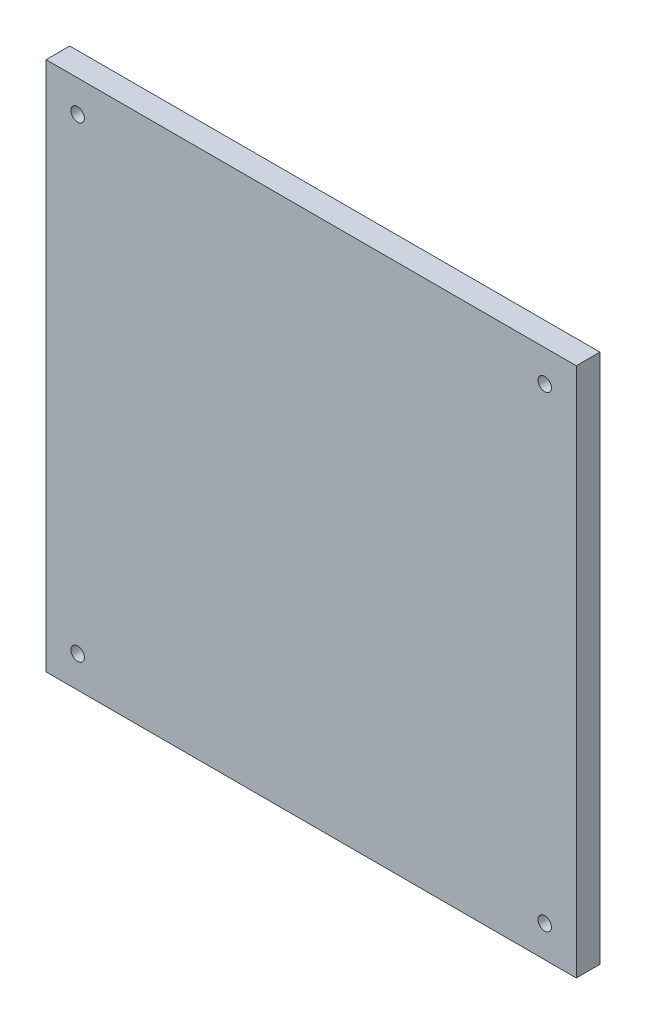
ISO-10303-21;
HEADER;
FILE_DESCRIPTION(('STEP AP214'),'2;1');
FILE_NAME('part.step','',(''),(''),'','','');
FILE_SCHEMA(('AUTOMOTIVE_DESIGN { 1 0 10303 214 1 1 1 1 }'));
ENDSEC;
DATA;
#1=APPLICATION_CONTEXT('core data for automotive mechanical design processes');
#2=APPLICATION_PROTOCOL_DEFINITION('international standard','automotive_design',2000,#1);
#3=PRODUCT_CONTEXT('',#1,'mechanical');
#4=PRODUCT('Part','Part','',(#3));
#5=PRODUCT_RELATED_PRODUCT_CATEGORY('part','',(#4));
#6=PRODUCT_DEFINITION_FORMATION('','',#4);
#7=PRODUCT_DEFINITION_CONTEXT('part definition',#1,'design');
#8=PRODUCT_DEFINITION('design','',#6,#7);
#9=PRODUCT_DEFINITION_SHAPE('','',#8);
#10=(LENGTH_UNIT() NAMED_UNIT(*) SI_UNIT(.MILLI.,.METRE.));
#11=(NAMED_UNIT(*) PLANE_ANGLE_UNIT() SI_UNIT($,.RADIAN.));
#12=(NAMED_UNIT(*) SI_UNIT($,.STERADIAN.) SOLID_ANGLE_UNIT());
#13=UNCERTAINTY_MEASURE_WITH_UNIT(LENGTH_MEASURE(1.E-05),#10,'distance_accuracy_value','');
#14=(GEOMETRIC_REPRESENTATION_CONTEXT(3) GLOBAL_UNCERTAINTY_ASSIGNED_CONTEXT((#13)) GLOBAL_UNIT_ASSIGNED_CONTEXT((#10,
#11,#12)) REPRESENTATION_CONTEXT('',''));
#15=CARTESIAN_POINT('',(0.,0.,0.));
#16=DIRECTION('',(0.,0.,1.));
#17=DIRECTION('',(1.,0.,0.));
#18=AXIS2_PLACEMENT_3D('',#15,#16,#17);
#19=CARTESIAN_POINT('',(133.35,-133.35,11.90625));
#20=DIRECTION('',(-1.,0.,0.));
#21=DIRECTION('',(0.,0.,1.));
#22=AXIS2_PLACEMENT_3D('',#19,#20,#21);
#23=PLANE('',#22);
#24=DIRECTION('',(0.,1.,0.));
#25=VECTOR('',#24,1.);
#26=CARTESIAN_POINT('',(133.35,-133.35,0.));
#27=LINE('',#26,#25);
#28=CARTESIAN_POINT('',(133.35,-133.35,0.));
#29=VERTEX_POINT('',#28);
#30=CARTESIAN_POINT('',(133.35,133.35,0.));
#31=VERTEX_POINT('',#30);
#32=EDGE_CURVE('E107',#29,#31,#27,.T.);
#33=ORIENTED_EDGE('',*,*,#32,.T.);
#34=DIRECTION('',(0.,0.,-1.));
#35=VECTOR('',#34,1.);
#36=CARTESIAN_POINT('',(133.35,133.35,11.90625));
#37=LINE('',#36,#35);
#38=CARTESIAN_POINT('',(133.35,133.35,11.90625));
#39=VERTEX_POINT('',#38);
#40=EDGE_CURVE('E13',#39,#31,#37,.T.);
#41=ORIENTED_EDGE('',*,*,#40,.F.);
#42=DIRECTION('',(0.,1.,0.));
#43=VECTOR('',#42,1.);
#44=CARTESIAN_POINT('',(133.35,-133.35,11.90625));
#45=LINE('',#44,#43);
#46=CARTESIAN_POINT('',(133.35,-133.35,11.90625));
#47=VERTEX_POINT('',#46);
#48=EDGE_CURVE('E95',#47,#39,#45,.T.);
#49=ORIENTED_EDGE('',*,*,#48,.F.);
#50=DIRECTION('',(0.,0.,-1.));
#51=VECTOR('',#50,1.);
#52=CARTESIAN_POINT('',(133.35,-133.35,11.90625));
#53=LINE('',#52,#51);
#54=EDGE_CURVE('E103',#47,#29,#53,.T.);
#55=ORIENTED_EDGE('',*,*,#54,.T.);
#56=EDGE_LOOP('',(#33,#41,#49,#55));
#57=FACE_BOUND('',#56,.T.);
#58=ADVANCED_FACE('F44',(#57),#23,.F.);
#59=CARTESIAN_POINT('',(-133.35,133.35,11.90625));
#60=DIRECTION('',(0.,-1.,0.));
#61=DIRECTION('',(0.,0.,-1.));
#62=AXIS2_PLACEMENT_3D('',#59,#60,#61);
#63=PLANE('',#62);
#64=DIRECTION('',(-1.,0.,0.));
#65=VECTOR('',#64,1.);
#66=CARTESIAN_POINT('',(-133.35,133.35,0.));
#67=LINE('',#66,#65);
#68=CARTESIAN_POINT('',(-133.35,133.35,0.));
#69=VERTEX_POINT('',#68);
#70=EDGE_CURVE('E99',#31,#69,#67,.T.);
#71=ORIENTED_EDGE('',*,*,#70,.T.);
#72=DIRECTION('',(0.,0.,-1.));
#73=VECTOR('',#72,1.);
#74=CARTESIAN_POINT('',(-133.35,133.35,11.90625));
#75=LINE('',#74,#73);
#76=CARTESIAN_POINT('',(-133.35,133.35,11.90625));
#77=VERTEX_POINT('',#76);
#78=EDGE_CURVE('E52',#77,#69,#75,.T.);
#79=ORIENTED_EDGE('',*,*,#78,.F.);
#80=DIRECTION('',(-1.,0.,0.));
#81=VECTOR('',#80,1.);
#82=CARTESIAN_POINT('',(-133.35,133.35,11.90625));
#83=LINE('',#82,#81);
#84=EDGE_CURVE('E90',#39,#77,#83,.T.);
#85=ORIENTED_EDGE('',*,*,#84,.F.);
#86=ORIENTED_EDGE('',*,*,#40,.T.);
#87=EDGE_LOOP('',(#71,#79,#85,#86));
#88=FACE_BOUND('',#87,.T.);
#89=ADVANCED_FACE('F98',(#88),#63,.F.);
#90=CARTESIAN_POINT('',(-133.35,-133.35,11.90625));
#91=DIRECTION('',(1.,0.,0.));
#92=DIRECTION('',(0.,0.,-1.));
#93=AXIS2_PLACEMENT_3D('',#90,#91,#92);
#94=PLANE('',#93);
#95=DIRECTION('',(0.,-1.,0.));
#96=VECTOR('',#95,1.);
#97=CARTESIAN_POINT('',(-133.35,-133.35,0.));
#98=LINE('',#97,#96);
#99=CARTESIAN_POINT('',(-133.35,-133.35,0.));
#100=VERTEX_POINT('',#99);
#101=EDGE_CURVE('E77',#69,#100,#98,.T.);
#102=ORIENTED_EDGE('',*,*,#101,.T.);
#103=DIRECTION('',(0.,0.,-1.));
#104=VECTOR('',#103,1.);
#105=CARTESIAN_POINT('',(-133.35,-133.35,11.90625));
#106=LINE('',#105,#104);
#107=CARTESIAN_POINT('',(-133.35,-133.35,11.90625));
#108=VERTEX_POINT('',#107);
#109=EDGE_CURVE('E100',#108,#100,#106,.T.);
#110=ORIENTED_EDGE('',*,*,#109,.F.);
#111=DIRECTION('',(0.,-1.,0.));
#112=VECTOR('',#111,1.);
#113=CARTESIAN_POINT('',(-133.35,-133.35,11.90625));
#114=LINE('',#113,#112);
#115=EDGE_CURVE('E93',#77,#108,#114,.T.);
#116=ORIENTED_EDGE('',*,*,#115,.F.);
#117=ORIENTED_EDGE('',*,*,#78,.T.);
#118=EDGE_LOOP('',(#102,#110,#116,#117));
#119=FACE_BOUND('',#118,.T.);
#120=ADVANCED_FACE('F101',(#119),#94,.F.);
#121=CARTESIAN_POINT('',(-133.35,-133.35,11.90625));
#122=DIRECTION('',(0.,1.,0.));
#123=DIRECTION('',(0.,0.,1.));
#124=AXIS2_PLACEMENT_3D('',#121,#122,#123);
#125=PLANE('',#124);
#126=DIRECTION('',(1.,0.,0.));
#127=VECTOR('',#126,1.);
#128=CARTESIAN_POINT('',(-133.35,-133.35,0.));
#129=LINE('',#128,#127);
#130=EDGE_CURVE('E83',#100,#29,#129,.T.);
#131=ORIENTED_EDGE('',*,*,#130,.T.);
#132=ORIENTED_EDGE('',*,*,#54,.F.);
#133=DIRECTION('',(1.,0.,0.));
#134=VECTOR('',#133,1.);
#135=CARTESIAN_POINT('',(-133.35,-133.35,11.90625));
#136=LINE('',#135,#134);
#137=EDGE_CURVE('E60',#108,#47,#136,.T.);
#138=ORIENTED_EDGE('',*,*,#137,.F.);
#139=ORIENTED_EDGE('',*,*,#109,.T.);
#140=EDGE_LOOP('',(#131,#132,#138,#139));
#141=FACE_BOUND('',#140,.T.);
#142=ADVANCED_FACE('F115',(#141),#125,.F.);
#143=CARTESIAN_POINT('',(0.,0.,11.90625));
#144=DIRECTION('',(0.,0.,-1.));
#145=DIRECTION('',(-1.,0.,0.));
#146=AXIS2_PLACEMENT_3D('',#143,#144,#145);
#147=PLANE('',#146);
#148=CARTESIAN_POINT('',(-117.475,117.475,11.90625));
#149=DIRECTION('',(0.,0.,1.));
#150=DIRECTION('',(1.,0.,0.));
#151=AXIS2_PLACEMENT_3D('',#148,#149,#150);
#152=CIRCLE('',#151,3.3782);
#153=CARTESIAN_POINT('',(-114.0968,117.475,11.90625));
#154=VERTEX_POINT('',#153);
#155=EDGE_CURVE('E141',#154,#154,#152,.T.);
#156=ORIENTED_EDGE('',*,*,#155,.F.);
#157=EDGE_LOOP('',(#156));
#158=FACE_BOUND('',#157,.T.);
#159=CARTESIAN_POINT('',(117.475,117.475,11.90625));
#160=DIRECTION('',(0.,0.,1.));
#161=DIRECTION('',(1.,0.,0.));
#162=AXIS2_PLACEMENT_3D('',#159,#160,#161);
#163=CIRCLE('',#162,3.3782);
#164=CARTESIAN_POINT('',(120.8532,117.475,11.90625));
#165=VERTEX_POINT('',#164);
#166=EDGE_CURVE('E135',#165,#165,#163,.T.);
#167=ORIENTED_EDGE('',*,*,#166,.F.);
#168=EDGE_LOOP('',(#167));
#169=FACE_BOUND('',#168,.T.);
#170=CARTESIAN_POINT('',(117.475,-117.475,11.90625));
#171=DIRECTION('',(0.,0.,1.));
#172=DIRECTION('',(1.,0.,0.));
#173=AXIS2_PLACEMENT_3D('',#170,#171,#172);
#174=CIRCLE('',#173,3.3782);
#175=CARTESIAN_POINT('',(120.8532,-117.475,11.90625));
#176=VERTEX_POINT('',#175);
#177=EDGE_CURVE('E129',#176,#176,#174,.T.);
#178=ORIENTED_EDGE('',*,*,#177,.F.);
#179=EDGE_LOOP('',(#178));
#180=FACE_BOUND('',#179,.T.);
#181=CARTESIAN_POINT('',(-117.475,-117.475,11.90625));
#182=DIRECTION('',(0.,0.,1.));
#183=DIRECTION('',(1.,0.,0.));
#184=AXIS2_PLACEMENT_3D('',#181,#182,#183);
#185=CIRCLE('',#184,3.3782);
#186=CARTESIAN_POINT('',(-114.0968,-117.475,11.90625));
#187=VERTEX_POINT('',#186);
#188=EDGE_CURVE('E123',#187,#187,#185,.T.);
#189=ORIENTED_EDGE('',*,*,#188,.F.);
#190=EDGE_LOOP('',(#189));
#191=FACE_BOUND('',#190,.T.);
#192=ORIENTED_EDGE('',*,*,#48,.T.);
#193=ORIENTED_EDGE('',*,*,#84,.T.);
#194=ORIENTED_EDGE('',*,*,#115,.T.);
#195=ORIENTED_EDGE('',*,*,#137,.T.);
#196=EDGE_LOOP('',(#192,#193,#194,#195));
#197=FACE_BOUND('',#196,.T.);
#198=ADVANCED_FACE('F91',(#158,#169,#180,#191,#197),#147,.F.);
#199=CARTESIAN_POINT('',(0.,0.,0.));
#200=DIRECTION('',(0.,0.,-1.));
#201=DIRECTION('',(-1.,0.,0.));
#202=AXIS2_PLACEMENT_3D('',#199,#200,#201);
#203=PLANE('',#202);
#204=CARTESIAN_POINT('',(-117.475,117.475,0.));
#205=DIRECTION('',(0.,0.,1.));
#206=DIRECTION('',(1.,0.,0.));
#207=AXIS2_PLACEMENT_3D('',#204,#205,#206);
#208=CIRCLE('',#207,3.3782);
#209=CARTESIAN_POINT('',(-114.0968,117.475,0.));
#210=VERTEX_POINT('',#209);
#211=EDGE_CURVE('E138',#210,#210,#208,.T.);
#212=ORIENTED_EDGE('',*,*,#211,.T.);
#213=EDGE_LOOP('',(#212));
#214=FACE_BOUND('',#213,.T.);
#215=CARTESIAN_POINT('',(117.475,117.475,0.));
#216=DIRECTION('',(0.,0.,1.));
#217=DIRECTION('',(1.,0.,0.));
#218=AXIS2_PLACEMENT_3D('',#215,#216,#217);
#219=CIRCLE('',#218,3.3782);
#220=CARTESIAN_POINT('',(120.8532,117.475,0.));
#221=VERTEX_POINT('',#220);
#222=EDGE_CURVE('E132',#221,#221,#219,.T.);
#223=ORIENTED_EDGE('',*,*,#222,.T.);
#224=EDGE_LOOP('',(#223));
#225=FACE_BOUND('',#224,.T.);
#226=CARTESIAN_POINT('',(117.475,-117.475,0.));
#227=DIRECTION('',(0.,0.,1.));
#228=DIRECTION('',(1.,0.,0.));
#229=AXIS2_PLACEMENT_3D('',#226,#227,#228);
#230=CIRCLE('',#229,3.3782);
#231=CARTESIAN_POINT('',(120.8532,-117.475,0.));
#232=VERTEX_POINT('',#231);
#233=EDGE_CURVE('E126',#232,#232,#230,.T.);
#234=ORIENTED_EDGE('',*,*,#233,.T.);
#235=EDGE_LOOP('',(#234));
#236=FACE_BOUND('',#235,.T.);
#237=CARTESIAN_POINT('',(-117.475,-117.475,0.));
#238=DIRECTION('',(0.,0.,1.));
#239=DIRECTION('',(1.,0.,0.));
#240=AXIS2_PLACEMENT_3D('',#237,#238,#239);
#241=CIRCLE('',#240,3.3782);
#242=CARTESIAN_POINT('',(-114.0968,-117.475,0.));
#243=VERTEX_POINT('',#242);
#244=EDGE_CURVE('E110',#243,#243,#241,.T.);
#245=ORIENTED_EDGE('',*,*,#244,.T.);
#246=EDGE_LOOP('',(#245));
#247=FACE_BOUND('',#246,.T.);
#248=ORIENTED_EDGE('',*,*,#32,.F.);
#249=ORIENTED_EDGE('',*,*,#130,.F.);
#250=ORIENTED_EDGE('',*,*,#101,.F.);
#251=ORIENTED_EDGE('',*,*,#70,.F.);
#252=EDGE_LOOP('',(#248,#249,#250,#251));
#253=FACE_BOUND('',#252,.T.);
#254=ADVANCED_FACE('F118',(#214,#225,#236,#247,#253),#203,.T.);
#255=CARTESIAN_POINT('',(-117.475,-117.475,11.90625));
#256=DIRECTION('',(0.,0.,1.));
#257=DIRECTION('',(1.,0.,0.));
#258=AXIS2_PLACEMENT_3D('',#255,#256,#257);
#259=CYLINDRICAL_SURFACE('',#258,3.3782);
#260=ORIENTED_EDGE('',*,*,#244,.F.);
#261=EDGE_LOOP('',(#260));
#262=FACE_BOUND('',#261,.T.);
#263=ORIENTED_EDGE('',*,*,#188,.T.);
#264=EDGE_LOOP('',(#263));
#265=FACE_BOUND('',#264,.T.);
#266=ADVANCED_FACE('F156',(#262,#265),#259,.F.);
#267=CARTESIAN_POINT('',(117.475,-117.475,11.90625));
#268=DIRECTION('',(0.,0.,1.));
#269=DIRECTION('',(1.,0.,0.));
#270=AXIS2_PLACEMENT_3D('',#267,#268,#269);
#271=CYLINDRICAL_SURFACE('',#270,3.3782);
#272=ORIENTED_EDGE('',*,*,#233,.F.);
#273=EDGE_LOOP('',(#272));
#274=FACE_BOUND('',#273,.T.);
#275=ORIENTED_EDGE('',*,*,#177,.T.);
#276=EDGE_LOOP('',(#275));
#277=FACE_BOUND('',#276,.T.);
#278=ADVANCED_FACE('F158',(#274,#277),#271,.F.);
#279=CARTESIAN_POINT('',(117.475,117.475,11.90625));
#280=DIRECTION('',(0.,0.,1.));
#281=DIRECTION('',(1.,0.,0.));
#282=AXIS2_PLACEMENT_3D('',#279,#280,#281);
#283=CYLINDRICAL_SURFACE('',#282,3.3782);
#284=ORIENTED_EDGE('',*,*,#222,.F.);
#285=EDGE_LOOP('',(#284));
#286=FACE_BOUND('',#285,.T.);
#287=ORIENTED_EDGE('',*,*,#166,.T.);
#288=EDGE_LOOP('',(#287));
#289=FACE_BOUND('',#288,.T.);
#290=ADVANCED_FACE('F165',(#286,#289),#283,.F.);
#291=CARTESIAN_POINT('',(-117.475,117.475,11.90625));
#292=DIRECTION('',(0.,0.,1.));
#293=DIRECTION('',(1.,0.,0.));
#294=AXIS2_PLACEMENT_3D('',#291,#292,#293);
#295=CYLINDRICAL_SURFACE('',#294,3.3782);
#296=ORIENTED_EDGE('',*,*,#211,.F.);
#297=EDGE_LOOP('',(#296));
#298=FACE_BOUND('',#297,.T.);
#299=ORIENTED_EDGE('',*,*,#155,.T.);
#300=EDGE_LOOP('',(#299));
#301=FACE_BOUND('',#300,.T.);
#302=ADVANCED_FACE('F145',(#298,#301),#295,.F.);
#303=CLOSED_SHELL('',(#58,#89,#120,#142,#198,#254,#266,#278,#290,#302));
#304=MANIFOLD_SOLID_BREP('B2',#303);
#305=ADVANCED_BREP_SHAPE_REPRESENTATION('',(#18,#304),#14);
#306=SHAPE_DEFINITION_REPRESENTATION(#9,#305);
ENDSEC;
END-ISO-10303-21;
